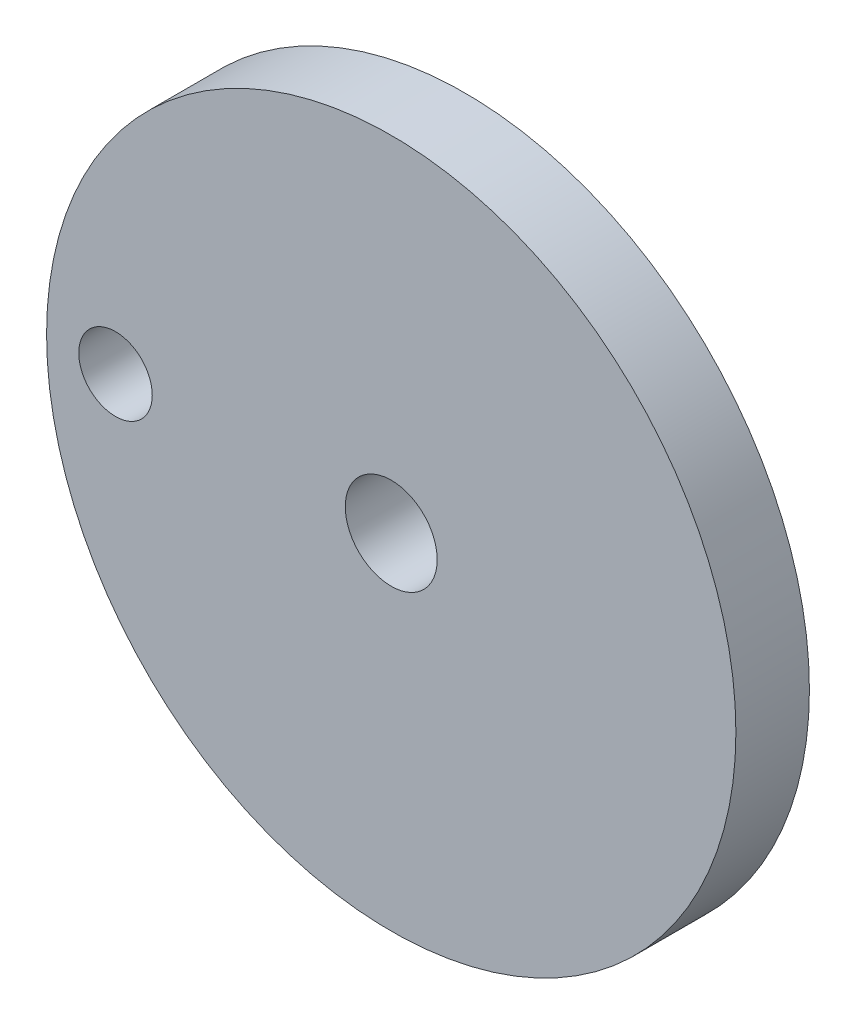
ISO-10303-21;
HEADER;
FILE_DESCRIPTION(('STEP AP214'),'2;1');
FILE_NAME('part.step','',(''),(''),'','','');
FILE_SCHEMA(('AUTOMOTIVE_DESIGN { 1 0 10303 214 1 1 1 1 }'));
ENDSEC;
DATA;
#1=APPLICATION_CONTEXT('core data for automotive mechanical design processes');
#2=APPLICATION_PROTOCOL_DEFINITION('international standard','automotive_design',2000,#1);
#3=PRODUCT_CONTEXT('',#1,'mechanical');
#4=PRODUCT('Part','Part','',(#3));
#5=PRODUCT_RELATED_PRODUCT_CATEGORY('part','',(#4));
#6=PRODUCT_DEFINITION_FORMATION('','',#4);
#7=PRODUCT_DEFINITION_CONTEXT('part definition',#1,'design');
#8=PRODUCT_DEFINITION('design','',#6,#7);
#9=PRODUCT_DEFINITION_SHAPE('','',#8);
#10=(LENGTH_UNIT() NAMED_UNIT(*) SI_UNIT(.MILLI.,.METRE.));
#11=(NAMED_UNIT(*) PLANE_ANGLE_UNIT() SI_UNIT($,.RADIAN.));
#12=(NAMED_UNIT(*) SI_UNIT($,.STERADIAN.) SOLID_ANGLE_UNIT());
#13=UNCERTAINTY_MEASURE_WITH_UNIT(LENGTH_MEASURE(1.E-05),#10,'distance_accuracy_value','');
#14=(GEOMETRIC_REPRESENTATION_CONTEXT(3) GLOBAL_UNCERTAINTY_ASSIGNED_CONTEXT((#13)) GLOBAL_UNIT_ASSIGNED_CONTEXT((#10,
#11,#12)) REPRESENTATION_CONTEXT('',''));
#15=CARTESIAN_POINT('',(0.,0.,0.));
#16=DIRECTION('',(0.,0.,1.));
#17=DIRECTION('',(1.,0.,0.));
#18=AXIS2_PLACEMENT_3D('',#15,#16,#17);
#19=CARTESIAN_POINT('',(0.,0.,8.));
#20=DIRECTION('',(0.,0.,-1.));
#21=DIRECTION('',(-1.,0.,0.));
#22=AXIS2_PLACEMENT_3D('',#19,#20,#21);
#23=CYLINDRICAL_SURFACE('',#22,37.5);
#24=CARTESIAN_POINT('',(0.,0.,8.));
#25=DIRECTION('',(0.,0.,1.));
#26=DIRECTION('',(1.,0.,0.));
#27=AXIS2_PLACEMENT_3D('',#24,#25,#26);
#28=CIRCLE('',#27,37.5);
#29=CARTESIAN_POINT('',(37.5,0.,8.));
#30=VERTEX_POINT('',#29);
#31=EDGE_CURVE('E10',#30,#30,#28,.T.);
#32=ORIENTED_EDGE('',*,*,#31,.F.);
#33=EDGE_LOOP('',(#32));
#34=FACE_BOUND('',#33,.T.);
#35=CARTESIAN_POINT('',(0.,0.,0.));
#36=DIRECTION('',(0.,0.,1.));
#37=DIRECTION('',(1.,0.,0.));
#38=AXIS2_PLACEMENT_3D('',#35,#36,#37);
#39=CIRCLE('',#38,37.5);
#40=CARTESIAN_POINT('',(37.5,0.,0.));
#41=VERTEX_POINT('',#40);
#42=EDGE_CURVE('E44',#41,#41,#39,.T.);
#43=ORIENTED_EDGE('',*,*,#42,.T.);
#44=EDGE_LOOP('',(#43));
#45=FACE_BOUND('',#44,.T.);
#46=ADVANCED_FACE('F37',(#34,#45),#23,.T.);
#47=CARTESIAN_POINT('',(0.,0.,8.));
#48=DIRECTION('',(0.,0.,1.));
#49=DIRECTION('',(1.,0.,0.));
#50=AXIS2_PLACEMENT_3D('',#47,#48,#49);
#51=PLANE('',#50);
#52=CARTESIAN_POINT('',(0.,0.,8.));
#53=DIRECTION('',(0.,0.,1.));
#54=DIRECTION('',(1.,0.,0.));
#55=AXIS2_PLACEMENT_3D('',#52,#53,#54);
#56=CIRCLE('',#55,5.);
#57=CARTESIAN_POINT('',(5.,0.,8.));
#58=VERTEX_POINT('',#57);
#59=EDGE_CURVE('E61',#58,#58,#56,.T.);
#60=ORIENTED_EDGE('',*,*,#59,.F.);
#61=EDGE_LOOP('',(#60));
#62=FACE_BOUND('',#61,.T.);
#63=CARTESIAN_POINT('',(-30.,0.,8.));
#64=DIRECTION('',(0.,0.,1.));
#65=DIRECTION('',(1.,0.,0.));
#66=AXIS2_PLACEMENT_3D('',#63,#64,#65);
#67=CIRCLE('',#66,4.);
#68=CARTESIAN_POINT('',(-26.,0.,8.));
#69=VERTEX_POINT('',#68);
#70=EDGE_CURVE('E52',#69,#69,#67,.T.);
#71=ORIENTED_EDGE('',*,*,#70,.F.);
#72=EDGE_LOOP('',(#71));
#73=FACE_BOUND('',#72,.T.);
#74=ORIENTED_EDGE('',*,*,#31,.T.);
#75=EDGE_LOOP('',(#74));
#76=FACE_BOUND('',#75,.T.);
#77=ADVANCED_FACE('F70',(#62,#73,#76),#51,.T.);
#78=CARTESIAN_POINT('',(0.,0.,0.));
#79=DIRECTION('',(0.,0.,1.));
#80=DIRECTION('',(1.,0.,0.));
#81=AXIS2_PLACEMENT_3D('',#78,#79,#80);
#82=PLANE('',#81);
#83=CARTESIAN_POINT('',(0.,0.,0.));
#84=DIRECTION('',(0.,0.,1.));
#85=DIRECTION('',(1.,0.,0.));
#86=AXIS2_PLACEMENT_3D('',#83,#84,#85);
#87=CIRCLE('',#86,5.);
#88=CARTESIAN_POINT('',(5.,0.,0.));
#89=VERTEX_POINT('',#88);
#90=EDGE_CURVE('E40',#89,#89,#87,.T.);
#91=ORIENTED_EDGE('',*,*,#90,.T.);
#92=EDGE_LOOP('',(#91));
#93=FACE_BOUND('',#92,.T.);
#94=CARTESIAN_POINT('',(-30.,0.,0.));
#95=DIRECTION('',(0.,0.,1.));
#96=DIRECTION('',(1.,0.,0.));
#97=AXIS2_PLACEMENT_3D('',#94,#95,#96);
#98=CIRCLE('',#97,4.);
#99=CARTESIAN_POINT('',(-26.,0.,0.));
#100=VERTEX_POINT('',#99);
#101=EDGE_CURVE('E49',#100,#100,#98,.T.);
#102=ORIENTED_EDGE('',*,*,#101,.T.);
#103=EDGE_LOOP('',(#102));
#104=FACE_BOUND('',#103,.T.);
#105=ORIENTED_EDGE('',*,*,#42,.F.);
#106=EDGE_LOOP('',(#105));
#107=FACE_BOUND('',#106,.T.);
#108=ADVANCED_FACE('F73',(#93,#104,#107),#82,.F.);
#109=CARTESIAN_POINT('',(-30.,0.,-5.));
#110=DIRECTION('',(0.,0.,1.));
#111=DIRECTION('',(1.,0.,0.));
#112=AXIS2_PLACEMENT_3D('',#109,#110,#111);
#113=CYLINDRICAL_SURFACE('',#112,4.);
#114=CARTESIAN_POINT('',(-26.,0.,8.));
#115=CARTESIAN_POINT('',(-26.,0.,7.91666666666667));
#116=CARTESIAN_POINT('',(-26.,0.,7.83333333333333));
#117=CARTESIAN_POINT('',(-26.,0.,7.66666666666667));
#118=CARTESIAN_POINT('',(-26.,0.,7.58333333333333));
#119=CARTESIAN_POINT('',(-26.,0.,7.41666666666667));
#120=CARTESIAN_POINT('',(-26.,0.,7.33333333333333));
#121=CARTESIAN_POINT('',(-26.,0.,7.16666666666667));
#122=CARTESIAN_POINT('',(-26.,0.,7.08333333333333));
#123=CARTESIAN_POINT('',(-26.,0.,6.91666666666667));
#124=CARTESIAN_POINT('',(-26.,0.,6.83333333333333));
#125=CARTESIAN_POINT('',(-26.,0.,6.66666666666667));
#126=CARTESIAN_POINT('',(-26.,0.,6.58333333333333));
#127=CARTESIAN_POINT('',(-26.,0.,6.41666666666667));
#128=CARTESIAN_POINT('',(-26.,0.,6.33333333333333));
#129=CARTESIAN_POINT('',(-26.,0.,6.16666666666667));
#130=CARTESIAN_POINT('',(-26.,0.,6.08333333333333));
#131=CARTESIAN_POINT('',(-26.,0.,5.91666666666667));
#132=CARTESIAN_POINT('',(-26.,0.,5.83333333333333));
#133=CARTESIAN_POINT('',(-26.,0.,5.66666666666667));
#134=CARTESIAN_POINT('',(-26.,0.,5.58333333333333));
#135=CARTESIAN_POINT('',(-26.,0.,5.41666666666667));
#136=CARTESIAN_POINT('',(-26.,0.,5.33333333333333));
#137=CARTESIAN_POINT('',(-26.,0.,5.16666666666667));
#138=CARTESIAN_POINT('',(-26.,0.,5.08333333333333));
#139=CARTESIAN_POINT('',(-26.,0.,4.91666666666667));
#140=CARTESIAN_POINT('',(-26.,0.,4.83333333333333));
#141=CARTESIAN_POINT('',(-26.,0.,4.66666666666667));
#142=CARTESIAN_POINT('',(-26.,0.,4.58333333333333));
#143=CARTESIAN_POINT('',(-26.,0.,4.41666666666667));
#144=CARTESIAN_POINT('',(-26.,0.,4.33333333333333));
#145=CARTESIAN_POINT('',(-26.,0.,4.16666666666667));
#146=CARTESIAN_POINT('',(-26.,0.,4.08333333333333));
#147=CARTESIAN_POINT('',(-26.,0.,3.91666666666667));
#148=CARTESIAN_POINT('',(-26.,0.,3.83333333333333));
#149=CARTESIAN_POINT('',(-26.,0.,3.66666666666667));
#150=CARTESIAN_POINT('',(-26.,0.,3.58333333333333));
#151=CARTESIAN_POINT('',(-26.,0.,3.41666666666667));
#152=CARTESIAN_POINT('',(-26.,0.,3.33333333333333));
#153=CARTESIAN_POINT('',(-26.,0.,3.16666666666667));
#154=CARTESIAN_POINT('',(-26.,0.,3.08333333333333));
#155=CARTESIAN_POINT('',(-26.,0.,2.91666666666667));
#156=CARTESIAN_POINT('',(-26.,0.,2.83333333333333));
#157=CARTESIAN_POINT('',(-26.,0.,2.66666666666667));
#158=CARTESIAN_POINT('',(-26.,0.,2.58333333333333));
#159=CARTESIAN_POINT('',(-26.,0.,2.41666666666667));
#160=CARTESIAN_POINT('',(-26.,0.,2.33333333333333));
#161=CARTESIAN_POINT('',(-26.,0.,2.16666666666667));
#162=CARTESIAN_POINT('',(-26.,0.,2.08333333333333));
#163=CARTESIAN_POINT('',(-26.,0.,1.91666666666667));
#164=CARTESIAN_POINT('',(-26.,0.,1.83333333333333));
#165=CARTESIAN_POINT('',(-26.,0.,1.66666666666667));
#166=CARTESIAN_POINT('',(-26.,0.,1.58333333333333));
#167=CARTESIAN_POINT('',(-26.,0.,1.41666666666667));
#168=CARTESIAN_POINT('',(-26.,0.,1.33333333333333));
#169=CARTESIAN_POINT('',(-26.,0.,1.16666666666667));
#170=CARTESIAN_POINT('',(-26.,0.,1.08333333333333));
#171=CARTESIAN_POINT('',(-26.,0.,0.916666666666666));
#172=CARTESIAN_POINT('',(-26.,0.,0.833333333333332));
#173=CARTESIAN_POINT('',(-26.,0.,0.666666666666666));
#174=CARTESIAN_POINT('',(-26.,0.,0.583333333333333));
#175=CARTESIAN_POINT('',(-26.,0.,0.416666666666666));
#176=CARTESIAN_POINT('',(-26.,0.,0.333333333333333));
#177=CARTESIAN_POINT('',(-26.,0.,0.166666666666666));
#178=CARTESIAN_POINT('',(-26.,0.,0.0833333333333325));
#179=CARTESIAN_POINT('',(-26.,0.,0.));
#180=B_SPLINE_CURVE_WITH_KNOTS('',3,(#114,#115,#116,#117,#118,#119,#120,#121,#122,#123,#124,
#125,#126,#127,#128,#129,#130,#131,#132,#133,#134,#135,#136,#137,#138,#139,#140,#141,#142,#143,
#144,#145,#146,#147,#148,#149,#150,#151,#152,#153,#154,#155,#156,#157,#158,#159,#160,#161,#162,
#163,#164,#165,#166,#167,#168,#169,#170,#171,#172,#173,#174,#175,#176,#177,#178,#179),
.UNSPECIFIED.,.F.,.F.,(4,2,2,2,2,2,2,2,2,2,2,2,2,2,2,2,2,2,2,2,2,2,2,2,2,2,2,2,2,2,2,2,4),(0.,
0.25,0.5,0.750000000000001,1.,1.25,1.5,1.75,2.,2.25,2.5,2.75,3.,3.25,3.5,3.75,4.,4.25,4.5,4.75,
5.,5.25,5.5,5.75,6.,6.25,6.5,6.75,7.,7.25,7.5,7.75,8.),.UNSPECIFIED.);
#181=EDGE_CURVE('BSEAM79',#69,#100,#180,.T.);
#182=ORIENTED_EDGE('',*,*,#70,.T.);
#183=ORIENTED_EDGE('',*,*,#101,.F.);
#184=ORIENTED_EDGE('',*,*,#181,.T.);
#185=ORIENTED_EDGE('',*,*,#181,.F.);
#186=EDGE_LOOP('',(#182,#184,#183,#185));
#187=FACE_BOUND('',#186,.T.);
#188=ADVANCED_FACE('F79',(#187),#113,.F.);
#189=CARTESIAN_POINT('',(0.,0.,-5.));
#190=DIRECTION('',(0.,0.,1.));
#191=DIRECTION('',(1.,0.,0.));
#192=AXIS2_PLACEMENT_3D('',#189,#190,#191);
#193=CYLINDRICAL_SURFACE('',#192,5.);
#194=CARTESIAN_POINT('',(5.,0.,8.));
#195=CARTESIAN_POINT('',(5.,0.,7.91666666666667));
#196=CARTESIAN_POINT('',(5.,0.,7.83333333333333));
#197=CARTESIAN_POINT('',(5.,0.,7.66666666666667));
#198=CARTESIAN_POINT('',(5.,0.,7.58333333333333));
#199=CARTESIAN_POINT('',(5.,0.,7.41666666666667));
#200=CARTESIAN_POINT('',(5.,0.,7.33333333333333));
#201=CARTESIAN_POINT('',(5.,0.,7.16666666666667));
#202=CARTESIAN_POINT('',(5.,0.,7.08333333333333));
#203=CARTESIAN_POINT('',(5.,0.,6.91666666666667));
#204=CARTESIAN_POINT('',(5.,0.,6.83333333333333));
#205=CARTESIAN_POINT('',(5.,0.,6.66666666666667));
#206=CARTESIAN_POINT('',(5.,0.,6.58333333333333));
#207=CARTESIAN_POINT('',(5.,0.,6.41666666666667));
#208=CARTESIAN_POINT('',(5.,0.,6.33333333333333));
#209=CARTESIAN_POINT('',(5.,0.,6.16666666666667));
#210=CARTESIAN_POINT('',(5.,0.,6.08333333333333));
#211=CARTESIAN_POINT('',(5.,0.,5.91666666666667));
#212=CARTESIAN_POINT('',(5.,0.,5.83333333333333));
#213=CARTESIAN_POINT('',(5.,0.,5.66666666666667));
#214=CARTESIAN_POINT('',(5.,0.,5.58333333333333));
#215=CARTESIAN_POINT('',(5.,0.,5.41666666666667));
#216=CARTESIAN_POINT('',(5.,0.,5.33333333333333));
#217=CARTESIAN_POINT('',(5.,0.,5.16666666666667));
#218=CARTESIAN_POINT('',(5.,0.,5.08333333333333));
#219=CARTESIAN_POINT('',(5.,0.,4.91666666666667));
#220=CARTESIAN_POINT('',(5.,0.,4.83333333333333));
#221=CARTESIAN_POINT('',(5.,0.,4.66666666666667));
#222=CARTESIAN_POINT('',(5.,0.,4.58333333333333));
#223=CARTESIAN_POINT('',(5.,0.,4.41666666666667));
#224=CARTESIAN_POINT('',(5.,0.,4.33333333333333));
#225=CARTESIAN_POINT('',(5.,0.,4.16666666666667));
#226=CARTESIAN_POINT('',(5.,0.,4.08333333333333));
#227=CARTESIAN_POINT('',(5.,0.,3.91666666666667));
#228=CARTESIAN_POINT('',(5.,0.,3.83333333333333));
#229=CARTESIAN_POINT('',(5.,0.,3.66666666666667));
#230=CARTESIAN_POINT('',(5.,0.,3.58333333333333));
#231=CARTESIAN_POINT('',(5.,0.,3.41666666666667));
#232=CARTESIAN_POINT('',(5.,0.,3.33333333333333));
#233=CARTESIAN_POINT('',(5.,0.,3.16666666666667));
#234=CARTESIAN_POINT('',(5.,0.,3.08333333333333));
#235=CARTESIAN_POINT('',(5.,0.,2.91666666666667));
#236=CARTESIAN_POINT('',(5.,0.,2.83333333333333));
#237=CARTESIAN_POINT('',(5.,0.,2.66666666666667));
#238=CARTESIAN_POINT('',(5.,0.,2.58333333333333));
#239=CARTESIAN_POINT('',(5.,0.,2.41666666666667));
#240=CARTESIAN_POINT('',(5.,0.,2.33333333333333));
#241=CARTESIAN_POINT('',(5.,0.,2.16666666666667));
#242=CARTESIAN_POINT('',(5.,0.,2.08333333333333));
#243=CARTESIAN_POINT('',(5.,0.,1.91666666666667));
#244=CARTESIAN_POINT('',(5.,0.,1.83333333333333));
#245=CARTESIAN_POINT('',(5.,0.,1.66666666666667));
#246=CARTESIAN_POINT('',(5.,0.,1.58333333333333));
#247=CARTESIAN_POINT('',(5.,0.,1.41666666666667));
#248=CARTESIAN_POINT('',(5.,0.,1.33333333333333));
#249=CARTESIAN_POINT('',(5.,0.,1.16666666666667));
#250=CARTESIAN_POINT('',(5.,0.,1.08333333333333));
#251=CARTESIAN_POINT('',(5.,0.,0.916666666666666));
#252=CARTESIAN_POINT('',(5.,0.,0.833333333333332));
#253=CARTESIAN_POINT('',(5.,0.,0.666666666666666));
#254=CARTESIAN_POINT('',(5.,0.,0.583333333333333));
#255=CARTESIAN_POINT('',(5.,0.,0.416666666666666));
#256=CARTESIAN_POINT('',(5.,0.,0.333333333333333));
#257=CARTESIAN_POINT('',(5.,0.,0.166666666666666));
#258=CARTESIAN_POINT('',(5.,0.,0.0833333333333325));
#259=CARTESIAN_POINT('',(5.,0.,0.));
#260=B_SPLINE_CURVE_WITH_KNOTS('',3,(#194,#195,#196,#197,#198,#199,#200,#201,#202,#203,#204,
#205,#206,#207,#208,#209,#210,#211,#212,#213,#214,#215,#216,#217,#218,#219,#220,#221,#222,#223,
#224,#225,#226,#227,#228,#229,#230,#231,#232,#233,#234,#235,#236,#237,#238,#239,#240,#241,#242,
#243,#244,#245,#246,#247,#248,#249,#250,#251,#252,#253,#254,#255,#256,#257,#258,#259),
.UNSPECIFIED.,.F.,.F.,(4,2,2,2,2,2,2,2,2,2,2,2,2,2,2,2,2,2,2,2,2,2,2,2,2,2,2,2,2,2,2,2,4),(0.,
0.25,0.5,0.750000000000001,1.,1.25,1.5,1.75,2.,2.25,2.5,2.75,3.,3.25,3.5,3.75,4.,4.25,4.5,4.75,
5.,5.25,5.5,5.75,6.,6.25,6.5,6.75,7.,7.25,7.5,7.75,8.),.UNSPECIFIED.);
#261=EDGE_CURVE('BSEAM67',#58,#89,#260,.T.);
#262=ORIENTED_EDGE('',*,*,#59,.T.);
#263=ORIENTED_EDGE('',*,*,#90,.F.);
#264=ORIENTED_EDGE('',*,*,#261,.T.);
#265=ORIENTED_EDGE('',*,*,#261,.F.);
#266=EDGE_LOOP('',(#262,#264,#263,#265));
#267=FACE_BOUND('',#266,.T.);
#268=ADVANCED_FACE('F67',(#267),#193,.F.);
#269=CLOSED_SHELL('',(#46,#77,#108,#188,#268));
#270=MANIFOLD_SOLID_BREP('B2',#269);
#271=ADVANCED_BREP_SHAPE_REPRESENTATION('',(#18,#270),#14);
#272=SHAPE_DEFINITION_REPRESENTATION(#9,#271);
ENDSEC;
END-ISO-10303-21;
